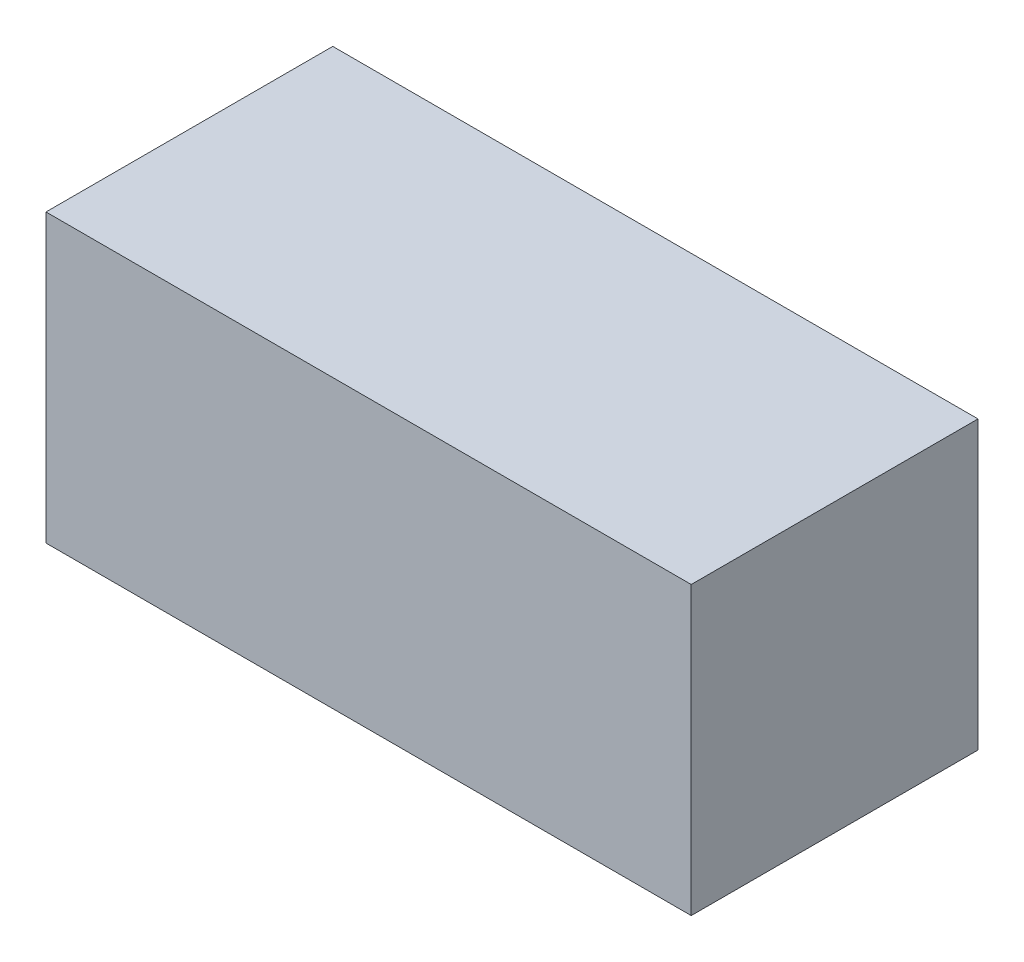
ISO-10303-21;
HEADER;
FILE_DESCRIPTION(('STEP AP214'),'2;1');
FILE_NAME('part.step','',(''),(''),'','','');
FILE_SCHEMA(('AUTOMOTIVE_DESIGN { 1 0 10303 214 1 1 1 1 }'));
ENDSEC;
DATA;
#1=APPLICATION_CONTEXT('core data for automotive mechanical design processes');
#2=APPLICATION_PROTOCOL_DEFINITION('international standard','automotive_design',2000,#1);
#3=PRODUCT_CONTEXT('',#1,'mechanical');
#4=PRODUCT('Part','Part','',(#3));
#5=PRODUCT_RELATED_PRODUCT_CATEGORY('part','',(#4));
#6=PRODUCT_DEFINITION_FORMATION('','',#4);
#7=PRODUCT_DEFINITION_CONTEXT('part definition',#1,'design');
#8=PRODUCT_DEFINITION('design','',#6,#7);
#9=PRODUCT_DEFINITION_SHAPE('','',#8);
#10=(LENGTH_UNIT() NAMED_UNIT(*) SI_UNIT(.MILLI.,.METRE.));
#11=(NAMED_UNIT(*) PLANE_ANGLE_UNIT() SI_UNIT($,.RADIAN.));
#12=(NAMED_UNIT(*) SI_UNIT($,.STERADIAN.) SOLID_ANGLE_UNIT());
#13=UNCERTAINTY_MEASURE_WITH_UNIT(LENGTH_MEASURE(1.E-05),#10,'distance_accuracy_value','');
#14=(GEOMETRIC_REPRESENTATION_CONTEXT(3) GLOBAL_UNCERTAINTY_ASSIGNED_CONTEXT((#13)) GLOBAL_UNIT_ASSIGNED_CONTEXT((#10,
#11,#12)) REPRESENTATION_CONTEXT('',''));
#15=CARTESIAN_POINT('',(0.,0.,0.));
#16=DIRECTION('',(0.,0.,1.));
#17=DIRECTION('',(1.,0.,0.));
#18=AXIS2_PLACEMENT_3D('',#15,#16,#17);
#19=CARTESIAN_POINT('',(22.5,10.,20.));
#20=DIRECTION('',(-1.,0.,0.));
#21=DIRECTION('',(0.,-1.,0.));
#22=AXIS2_PLACEMENT_3D('',#19,#20,#21);
#23=PLANE('',#22);
#24=DIRECTION('',(0.,1.,0.));
#25=VECTOR('',#24,1.);
#26=CARTESIAN_POINT('',(22.5,10.,0.));
#27=LINE('',#26,#25);
#28=CARTESIAN_POINT('',(22.5,-10.,0.));
#29=VERTEX_POINT('',#28);
#30=CARTESIAN_POINT('',(22.5,10.,0.));
#31=VERTEX_POINT('',#30);
#32=EDGE_CURVE('E96',#29,#31,#27,.T.);
#33=ORIENTED_EDGE('',*,*,#32,.T.);
#34=DIRECTION('',(0.,0.,-1.));
#35=VECTOR('',#34,1.);
#36=CARTESIAN_POINT('',(22.5,10.,20.));
#37=LINE('',#36,#35);
#38=CARTESIAN_POINT('',(22.5,10.,20.));
#39=VERTEX_POINT('',#38);
#40=EDGE_CURVE('E11',#39,#31,#37,.T.);
#41=ORIENTED_EDGE('',*,*,#40,.F.);
#42=DIRECTION('',(0.,1.,0.));
#43=VECTOR('',#42,1.);
#44=CARTESIAN_POINT('',(22.5,10.,20.));
#45=LINE('',#44,#43);
#46=CARTESIAN_POINT('',(22.5,-10.,20.));
#47=VERTEX_POINT('',#46);
#48=EDGE_CURVE('E84',#47,#39,#45,.T.);
#49=ORIENTED_EDGE('',*,*,#48,.F.);
#50=DIRECTION('',(0.,0.,-1.));
#51=VECTOR('',#50,1.);
#52=CARTESIAN_POINT('',(22.5,-10.,20.));
#53=LINE('',#52,#51);
#54=EDGE_CURVE('E92',#47,#29,#53,.T.);
#55=ORIENTED_EDGE('',*,*,#54,.T.);
#56=EDGE_LOOP('',(#33,#41,#49,#55));
#57=FACE_BOUND('',#56,.T.);
#58=ADVANCED_FACE('F33',(#57),#23,.F.);
#59=CARTESIAN_POINT('',(-22.5,10.,20.));
#60=DIRECTION('',(0.,-1.,0.));
#61=DIRECTION('',(0.,0.,-1.));
#62=AXIS2_PLACEMENT_3D('',#59,#60,#61);
#63=PLANE('',#62);
#64=DIRECTION('',(-1.,0.,0.));
#65=VECTOR('',#64,1.);
#66=CARTESIAN_POINT('',(-22.5,10.,0.));
#67=LINE('',#66,#65);
#68=CARTESIAN_POINT('',(-22.5,10.,0.));
#69=VERTEX_POINT('',#68);
#70=EDGE_CURVE('E88',#31,#69,#67,.T.);
#71=ORIENTED_EDGE('',*,*,#70,.T.);
#72=DIRECTION('',(0.,0.,-1.));
#73=VECTOR('',#72,1.);
#74=CARTESIAN_POINT('',(-22.5,10.,20.));
#75=LINE('',#74,#73);
#76=CARTESIAN_POINT('',(-22.5,10.,20.));
#77=VERTEX_POINT('',#76);
#78=EDGE_CURVE('E41',#77,#69,#75,.T.);
#79=ORIENTED_EDGE('',*,*,#78,.F.);
#80=DIRECTION('',(-1.,0.,0.));
#81=VECTOR('',#80,1.);
#82=CARTESIAN_POINT('',(-22.5,10.,20.));
#83=LINE('',#82,#81);
#84=EDGE_CURVE('E79',#39,#77,#83,.T.);
#85=ORIENTED_EDGE('',*,*,#84,.F.);
#86=ORIENTED_EDGE('',*,*,#40,.T.);
#87=EDGE_LOOP('',(#71,#79,#85,#86));
#88=FACE_BOUND('',#87,.T.);
#89=ADVANCED_FACE('F87',(#88),#63,.F.);
#90=CARTESIAN_POINT('',(-22.5,10.,20.));
#91=DIRECTION('',(1.,0.,0.));
#92=DIRECTION('',(0.,1.,0.));
#93=AXIS2_PLACEMENT_3D('',#90,#91,#92);
#94=PLANE('',#93);
#95=DIRECTION('',(0.,-1.,0.));
#96=VECTOR('',#95,1.);
#97=CARTESIAN_POINT('',(-22.5,10.,0.));
#98=LINE('',#97,#96);
#99=CARTESIAN_POINT('',(-22.5,-10.,0.));
#100=VERTEX_POINT('',#99);
#101=EDGE_CURVE('E66',#69,#100,#98,.T.);
#102=ORIENTED_EDGE('',*,*,#101,.T.);
#103=DIRECTION('',(0.,0.,-1.));
#104=VECTOR('',#103,1.);
#105=CARTESIAN_POINT('',(-22.5,-10.,20.));
#106=LINE('',#105,#104);
#107=CARTESIAN_POINT('',(-22.5,-10.,20.));
#108=VERTEX_POINT('',#107);
#109=EDGE_CURVE('E89',#108,#100,#106,.T.);
#110=ORIENTED_EDGE('',*,*,#109,.F.);
#111=DIRECTION('',(0.,-1.,0.));
#112=VECTOR('',#111,1.);
#113=CARTESIAN_POINT('',(-22.5,10.,20.));
#114=LINE('',#113,#112);
#115=EDGE_CURVE('E82',#77,#108,#114,.T.);
#116=ORIENTED_EDGE('',*,*,#115,.F.);
#117=ORIENTED_EDGE('',*,*,#78,.T.);
#118=EDGE_LOOP('',(#102,#110,#116,#117));
#119=FACE_BOUND('',#118,.T.);
#120=ADVANCED_FACE('F90',(#119),#94,.F.);
#121=CARTESIAN_POINT('',(-22.5,-10.,20.));
#122=DIRECTION('',(0.,1.,0.));
#123=DIRECTION('',(0.,0.,1.));
#124=AXIS2_PLACEMENT_3D('',#121,#122,#123);
#125=PLANE('',#124);
#126=DIRECTION('',(1.,0.,0.));
#127=VECTOR('',#126,1.);
#128=CARTESIAN_POINT('',(-22.5,-10.,0.));
#129=LINE('',#128,#127);
#130=EDGE_CURVE('E72',#100,#29,#129,.T.);
#131=ORIENTED_EDGE('',*,*,#130,.T.);
#132=ORIENTED_EDGE('',*,*,#54,.F.);
#133=DIRECTION('',(1.,0.,0.));
#134=VECTOR('',#133,1.);
#135=CARTESIAN_POINT('',(-22.5,-10.,20.));
#136=LINE('',#135,#134);
#137=EDGE_CURVE('E49',#108,#47,#136,.T.);
#138=ORIENTED_EDGE('',*,*,#137,.F.);
#139=ORIENTED_EDGE('',*,*,#109,.T.);
#140=EDGE_LOOP('',(#131,#132,#138,#139));
#141=FACE_BOUND('',#140,.T.);
#142=ADVANCED_FACE('F103',(#141),#125,.F.);
#143=CARTESIAN_POINT('',(0.,0.,20.));
#144=DIRECTION('',(0.,0.,1.));
#145=DIRECTION('',(1.,0.,0.));
#146=AXIS2_PLACEMENT_3D('',#143,#144,#145);
#147=PLANE('',#146);
#148=ORIENTED_EDGE('',*,*,#48,.T.);
#149=ORIENTED_EDGE('',*,*,#84,.T.);
#150=ORIENTED_EDGE('',*,*,#115,.T.);
#151=ORIENTED_EDGE('',*,*,#137,.T.);
#152=EDGE_LOOP('',(#148,#149,#150,#151));
#153=FACE_BOUND('',#152,.T.);
#154=ADVANCED_FACE('F80',(#153),#147,.T.);
#155=CARTESIAN_POINT('',(0.,0.,0.));
#156=DIRECTION('',(0.,0.,1.));
#157=DIRECTION('',(1.,0.,0.));
#158=AXIS2_PLACEMENT_3D('',#155,#156,#157);
#159=PLANE('',#158);
#160=ORIENTED_EDGE('',*,*,#32,.F.);
#161=ORIENTED_EDGE('',*,*,#130,.F.);
#162=ORIENTED_EDGE('',*,*,#101,.F.);
#163=ORIENTED_EDGE('',*,*,#70,.F.);
#164=EDGE_LOOP('',(#160,#161,#162,#163));
#165=FACE_BOUND('',#164,.T.);
#166=ADVANCED_FACE('F106',(#165),#159,.F.);
#167=CLOSED_SHELL('',(#58,#89,#120,#142,#154,#166));
#168=MANIFOLD_SOLID_BREP('B2',#167);
#169=ADVANCED_BREP_SHAPE_REPRESENTATION('',(#18,#168),#14);
#170=SHAPE_DEFINITION_REPRESENTATION(#9,#169);
ENDSEC;
END-ISO-10303-21;
